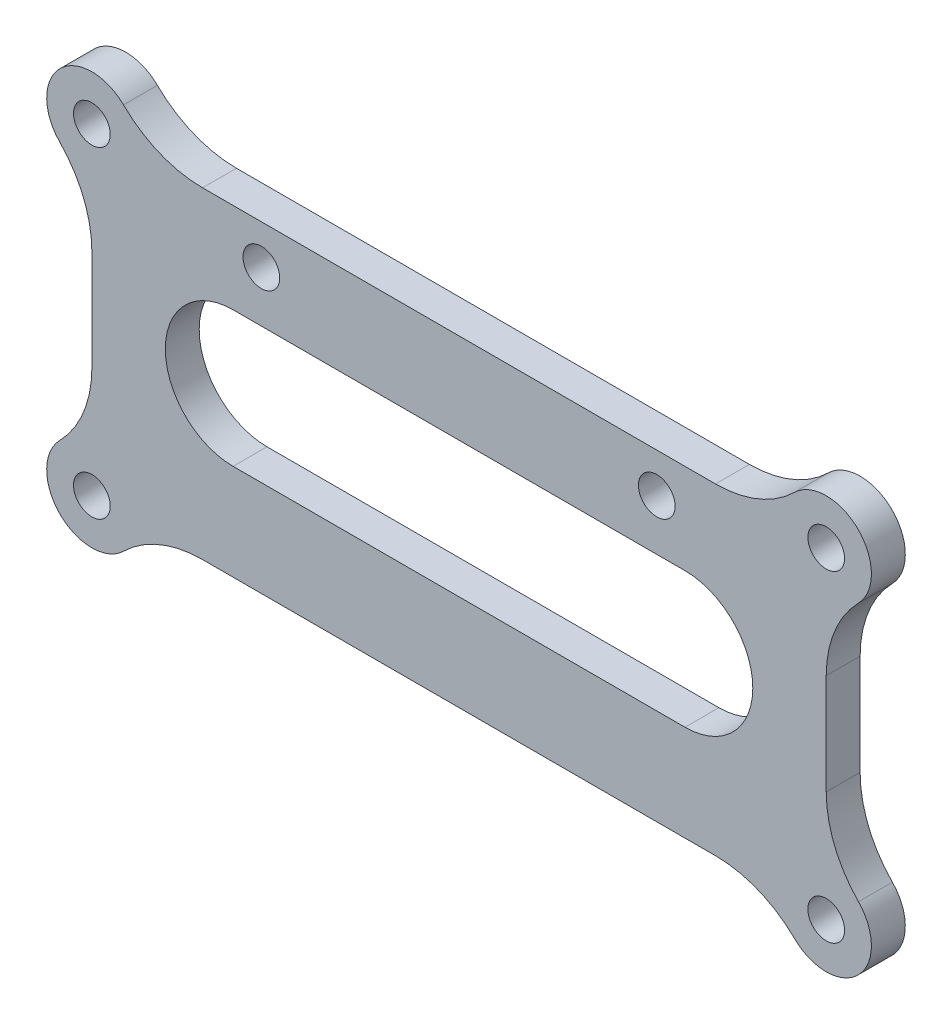
ISO-10303-21;
HEADER;
FILE_DESCRIPTION(('STEP AP214'),'2;1');
FILE_NAME('part.step','',(''),(''),'','','');
FILE_SCHEMA(('AUTOMOTIVE_DESIGN { 1 0 10303 214 1 1 1 1 }'));
ENDSEC;
DATA;
#1=APPLICATION_CONTEXT('core data for automotive mechanical design processes');
#2=APPLICATION_PROTOCOL_DEFINITION('international standard','automotive_design',2000,#1);
#3=PRODUCT_CONTEXT('',#1,'mechanical');
#4=PRODUCT('Part','Part','',(#3));
#5=PRODUCT_RELATED_PRODUCT_CATEGORY('part','',(#4));
#6=PRODUCT_DEFINITION_FORMATION('','',#4);
#7=PRODUCT_DEFINITION_CONTEXT('part definition',#1,'design');
#8=PRODUCT_DEFINITION('design','',#6,#7);
#9=PRODUCT_DEFINITION_SHAPE('','',#8);
#10=(LENGTH_UNIT() NAMED_UNIT(*) SI_UNIT(.MILLI.,.METRE.));
#11=(NAMED_UNIT(*) PLANE_ANGLE_UNIT() SI_UNIT($,.RADIAN.));
#12=(NAMED_UNIT(*) SI_UNIT($,.STERADIAN.) SOLID_ANGLE_UNIT());
#13=UNCERTAINTY_MEASURE_WITH_UNIT(LENGTH_MEASURE(1.E-05),#10,'distance_accuracy_value','');
#14=(GEOMETRIC_REPRESENTATION_CONTEXT(3) GLOBAL_UNCERTAINTY_ASSIGNED_CONTEXT((#13)) GLOBAL_UNIT_ASSIGNED_CONTEXT((#10,
#11,#12)) REPRESENTATION_CONTEXT('',''));
#15=CARTESIAN_POINT('',(0.,0.,0.));
#16=DIRECTION('',(0.,0.,1.));
#17=DIRECTION('',(1.,0.,0.));
#18=AXIS2_PLACEMENT_3D('',#15,#16,#17);
#19=CARTESIAN_POINT('',(32.4999999999997,0.,3.));
#20=DIRECTION('',(0.,0.,-1.));
#21=DIRECTION('',(-1.,0.,0.));
#22=AXIS2_PLACEMENT_3D('',#19,#20,#21);
#23=CYLINDRICAL_SURFACE('',#22,4.);
#24=CARTESIAN_POINT('',(32.4999999999997,0.,0.));
#25=DIRECTION('',(0.,0.,1.));
#26=DIRECTION('',(1.,0.,0.));
#27=AXIS2_PLACEMENT_3D('',#24,#25,#26);
#28=CIRCLE('',#27,4.);
#29=CARTESIAN_POINT('',(29.7005831511047,-2.85714285714286,0.));
#30=VERTEX_POINT('',#29);
#31=CARTESIAN_POINT('',(35.3571428571426,2.79941684889507,0.));
#32=VERTEX_POINT('',#31);
#33=EDGE_CURVE('E219',#30,#32,#28,.T.);
#34=ORIENTED_EDGE('',*,*,#33,.T.);
#35=DIRECTION('',(0.,0.,-1.));
#36=VECTOR('',#35,1.);
#37=CARTESIAN_POINT('',(35.3571428571426,2.79941684889507,3.));
#38=LINE('',#37,#36);
#39=CARTESIAN_POINT('',(35.3571428571426,2.79941684889507,3.));
#40=VERTEX_POINT('',#39);
#41=EDGE_CURVE('E309',#32,#40,#38,.F.);
#42=ORIENTED_EDGE('',*,*,#41,.T.);
#43=CARTESIAN_POINT('',(32.4999999999997,0.,3.));
#44=DIRECTION('',(0.,0.,1.));
#45=DIRECTION('',(1.,0.,0.));
#46=AXIS2_PLACEMENT_3D('',#43,#44,#45);
#47=CIRCLE('',#46,4.);
#48=CARTESIAN_POINT('',(29.7005831511047,-2.85714285714286,3.));
#49=VERTEX_POINT('',#48);
#50=EDGE_CURVE('E220',#49,#40,#47,.T.);
#51=ORIENTED_EDGE('',*,*,#50,.F.);
#52=DIRECTION('',(0.,0.,-1.));
#53=VECTOR('',#52,1.);
#54=CARTESIAN_POINT('',(29.7005831511047,-2.85714285714286,3.));
#55=LINE('',#54,#53);
#56=EDGE_CURVE('E306',#49,#30,#55,.T.);
#57=ORIENTED_EDGE('',*,*,#56,.T.);
#58=EDGE_LOOP('',(#34,#42,#51,#57));
#59=FACE_BOUND('',#58,.T.);
#60=ADVANCED_FACE('F36',(#59),#23,.T.);
#61=CARTESIAN_POINT('',(32.4999999999997,1.18691606251044E-13,3.));
#62=DIRECTION('',(-1.,0.,0.));
#63=DIRECTION('',(0.,-1.,0.));
#64=AXIS2_PLACEMENT_3D('',#61,#62,#63);
#65=PLANE('',#64);
#66=DIRECTION('',(0.,1.,0.));
#67=VECTOR('',#66,1.);
#68=CARTESIAN_POINT('',(32.4999999999997,1.18691606251044E-13,3.));
#69=LINE('',#68,#67);
#70=CARTESIAN_POINT('',(32.4999999999997,9.79795897113271,3.));
#71=VERTEX_POINT('',#70);
#72=CARTESIAN_POINT('',(32.4999999999996,18.7020410288673,3.));
#73=VERTEX_POINT('',#72);
#74=EDGE_CURVE('E223',#71,#73,#69,.T.);
#75=ORIENTED_EDGE('',*,*,#74,.F.);
#76=DIRECTION('',(0.,0.,1.));
#77=VECTOR('',#76,1.);
#78=CARTESIAN_POINT('',(32.4999999999997,9.79795897113271,0.));
#79=LINE('',#78,#77);
#80=CARTESIAN_POINT('',(32.4999999999997,9.79795897113271,0.));
#81=VERTEX_POINT('',#80);
#82=EDGE_CURVE('E303',#71,#81,#79,.F.);
#83=ORIENTED_EDGE('',*,*,#82,.T.);
#84=DIRECTION('',(0.,1.,0.));
#85=VECTOR('',#84,1.);
#86=CARTESIAN_POINT('',(32.4999999999997,1.18691606251044E-13,0.));
#87=LINE('',#86,#85);
#88=CARTESIAN_POINT('',(32.4999999999996,18.7020410288673,0.));
#89=VERTEX_POINT('',#88);
#90=EDGE_CURVE('E260',#81,#89,#87,.T.);
#91=ORIENTED_EDGE('',*,*,#90,.T.);
#92=DIRECTION('',(0.,0.,1.));
#93=VECTOR('',#92,1.);
#94=CARTESIAN_POINT('',(32.4999999999996,18.7020410288673,3.));
#95=LINE('',#94,#93);
#96=EDGE_CURVE('E301',#89,#73,#95,.T.);
#97=ORIENTED_EDGE('',*,*,#96,.T.);
#98=EDGE_LOOP('',(#75,#83,#91,#97));
#99=FACE_BOUND('',#98,.T.);
#100=ADVANCED_FACE('F368',(#99),#65,.F.);
#101=CARTESIAN_POINT('',(32.4999999999996,28.5,3.));
#102=DIRECTION('',(0.,0.,-1.));
#103=DIRECTION('',(-1.,0.,0.));
#104=AXIS2_PLACEMENT_3D('',#101,#102,#103);
#105=CYLINDRICAL_SURFACE('',#104,4.);
#106=CARTESIAN_POINT('',(32.4999999999996,28.5,0.));
#107=DIRECTION('',(0.,0.,1.));
#108=DIRECTION('',(1.,0.,0.));
#109=AXIS2_PLACEMENT_3D('',#106,#107,#108);
#110=CIRCLE('',#109,4.);
#111=CARTESIAN_POINT('',(35.3571428571425,25.700583151105,0.));
#112=VERTEX_POINT('',#111);
#113=CARTESIAN_POINT('',(29.7005831511046,31.3571428571429,0.));
#114=VERTEX_POINT('',#113);
#115=EDGE_CURVE('E263',#112,#114,#110,.T.);
#116=ORIENTED_EDGE('',*,*,#115,.T.);
#117=DIRECTION('',(0.,0.,-1.));
#118=VECTOR('',#117,1.);
#119=CARTESIAN_POINT('',(29.7005831511046,31.3571428571429,3.));
#120=LINE('',#119,#118);
#121=CARTESIAN_POINT('',(29.7005831511046,31.3571428571429,3.));
#122=VERTEX_POINT('',#121);
#123=EDGE_CURVE('E329',#114,#122,#120,.F.);
#124=ORIENTED_EDGE('',*,*,#123,.T.);
#125=CARTESIAN_POINT('',(32.4999999999996,28.5,3.));
#126=DIRECTION('',(0.,0.,1.));
#127=DIRECTION('',(1.,0.,0.));
#128=AXIS2_PLACEMENT_3D('',#125,#126,#127);
#129=CIRCLE('',#128,4.);
#130=CARTESIAN_POINT('',(35.3571428571425,25.700583151105,3.));
#131=VERTEX_POINT('',#130);
#132=EDGE_CURVE('E227',#131,#122,#129,.T.);
#133=ORIENTED_EDGE('',*,*,#132,.F.);
#134=DIRECTION('',(0.,0.,-1.));
#135=VECTOR('',#134,1.);
#136=CARTESIAN_POINT('',(35.3571428571425,25.700583151105,3.));
#137=LINE('',#136,#135);
#138=EDGE_CURVE('E326',#131,#112,#137,.T.);
#139=ORIENTED_EDGE('',*,*,#138,.T.);
#140=EDGE_LOOP('',(#116,#124,#133,#139));
#141=FACE_BOUND('',#140,.T.);
#142=ADVANCED_FACE('F377',(#141),#105,.T.);
#143=CARTESIAN_POINT('',(0.,28.5,3.));
#144=DIRECTION('',(0.,1.,0.));
#145=DIRECTION('',(0.,0.,1.));
#146=AXIS2_PLACEMENT_3D('',#143,#144,#145);
#147=PLANE('',#146);
#148=DIRECTION('',(1.,0.,0.));
#149=VECTOR('',#148,1.);
#150=CARTESIAN_POINT('',(0.,28.5,0.));
#151=LINE('',#150,#149);
#152=CARTESIAN_POINT('',(-22.7020410288674,28.5,0.));
#153=VERTEX_POINT('',#152);
#154=CARTESIAN_POINT('',(22.7020410288669,28.5,0.));
#155=VERTEX_POINT('',#154);
#156=EDGE_CURVE('E266',#153,#155,#151,.T.);
#157=ORIENTED_EDGE('',*,*,#156,.F.);
#158=DIRECTION('',(0.,0.,-1.));
#159=VECTOR('',#158,1.);
#160=CARTESIAN_POINT('',(-22.7020410288674,28.5,3.));
#161=LINE('',#160,#159);
#162=CARTESIAN_POINT('',(-22.7020410288674,28.5,3.));
#163=VERTEX_POINT('',#162);
#164=EDGE_CURVE('E324',#153,#163,#161,.F.);
#165=ORIENTED_EDGE('',*,*,#164,.T.);
#166=DIRECTION('',(1.,0.,0.));
#167=VECTOR('',#166,1.);
#168=CARTESIAN_POINT('',(0.,28.5,3.));
#169=LINE('',#168,#167);
#170=CARTESIAN_POINT('',(22.7020410288669,28.5,3.));
#171=VERTEX_POINT('',#170);
#172=EDGE_CURVE('E230',#163,#171,#169,.T.);
#173=ORIENTED_EDGE('',*,*,#172,.T.);
#174=DIRECTION('',(0.,0.,-1.));
#175=VECTOR('',#174,1.);
#176=CARTESIAN_POINT('',(22.7020410288669,28.5,3.));
#177=LINE('',#176,#175);
#178=EDGE_CURVE('E321',#171,#155,#177,.T.);
#179=ORIENTED_EDGE('',*,*,#178,.T.);
#180=EDGE_LOOP('',(#157,#165,#173,#179));
#181=FACE_BOUND('',#180,.T.);
#182=ADVANCED_FACE('F386',(#181),#147,.T.);
#183=CARTESIAN_POINT('',(-32.5000000000001,28.5,3.));
#184=DIRECTION('',(0.,0.,-1.));
#185=DIRECTION('',(-1.,0.,0.));
#186=AXIS2_PLACEMENT_3D('',#183,#184,#185);
#187=CYLINDRICAL_SURFACE('',#186,4.);
#188=CARTESIAN_POINT('',(-32.5000000000001,28.5,0.));
#189=DIRECTION('',(0.,0.,1.));
#190=DIRECTION('',(1.,0.,0.));
#191=AXIS2_PLACEMENT_3D('',#188,#189,#190);
#192=CIRCLE('',#191,4.);
#193=CARTESIAN_POINT('',(-29.700583151105,31.3571428571429,0.));
#194=VERTEX_POINT('',#193);
#195=CARTESIAN_POINT('',(-35.3571428571429,25.7005831511049,0.));
#196=VERTEX_POINT('',#195);
#197=EDGE_CURVE('E269',#194,#196,#192,.T.);
#198=ORIENTED_EDGE('',*,*,#197,.T.);
#199=DIRECTION('',(0.,0.,-1.));
#200=VECTOR('',#199,1.);
#201=CARTESIAN_POINT('',(-35.3571428571429,25.7005831511049,3.));
#202=LINE('',#201,#200);
#203=CARTESIAN_POINT('',(-35.3571428571429,25.7005831511049,3.));
#204=VERTEX_POINT('',#203);
#205=EDGE_CURVE('E299',#196,#204,#202,.F.);
#206=ORIENTED_EDGE('',*,*,#205,.T.);
#207=CARTESIAN_POINT('',(-32.5000000000001,28.5,3.));
#208=DIRECTION('',(0.,0.,1.));
#209=DIRECTION('',(1.,0.,0.));
#210=AXIS2_PLACEMENT_3D('',#207,#208,#209);
#211=CIRCLE('',#210,4.);
#212=CARTESIAN_POINT('',(-29.700583151105,31.3571428571429,3.));
#213=VERTEX_POINT('',#212);
#214=EDGE_CURVE('E233',#213,#204,#211,.T.);
#215=ORIENTED_EDGE('',*,*,#214,.F.);
#216=DIRECTION('',(0.,0.,-1.));
#217=VECTOR('',#216,1.);
#218=CARTESIAN_POINT('',(-29.700583151105,31.3571428571429,3.));
#219=LINE('',#218,#217);
#220=EDGE_CURVE('E296',#213,#194,#219,.T.);
#221=ORIENTED_EDGE('',*,*,#220,.T.);
#222=EDGE_LOOP('',(#198,#206,#215,#221));
#223=FACE_BOUND('',#222,.T.);
#224=ADVANCED_FACE('F394',(#223),#187,.T.);
#225=CARTESIAN_POINT('',(-32.4999999999999,-2.53208760002228E-13,3.));
#226=DIRECTION('',(-1.,0.,0.));
#227=DIRECTION('',(0.,-1.,0.));
#228=AXIS2_PLACEMENT_3D('',#225,#226,#227);
#229=PLANE('',#228);
#230=DIRECTION('',(0.,1.,0.));
#231=VECTOR('',#230,1.);
#232=CARTESIAN_POINT('',(-32.4999999999999,-2.53208760002228E-13,3.));
#233=LINE('',#232,#231);
#234=CARTESIAN_POINT('',(-32.5,9.79795897113271,3.));
#235=VERTEX_POINT('',#234);
#236=CARTESIAN_POINT('',(-32.5,18.7020410288673,3.));
#237=VERTEX_POINT('',#236);
#238=EDGE_CURVE('E236',#235,#237,#233,.T.);
#239=ORIENTED_EDGE('',*,*,#238,.T.);
#240=DIRECTION('',(0.,0.,-1.));
#241=VECTOR('',#240,1.);
#242=CARTESIAN_POINT('',(-32.5,18.7020410288673,3.));
#243=LINE('',#242,#241);
#244=CARTESIAN_POINT('',(-32.5,18.7020410288673,0.));
#245=VERTEX_POINT('',#244);
#246=EDGE_CURVE('E293',#237,#245,#243,.T.);
#247=ORIENTED_EDGE('',*,*,#246,.T.);
#248=DIRECTION('',(0.,1.,0.));
#249=VECTOR('',#248,1.);
#250=CARTESIAN_POINT('',(-32.4999999999999,-2.53208760002228E-13,0.));
#251=LINE('',#250,#249);
#252=CARTESIAN_POINT('',(-32.5,9.79795897113271,0.));
#253=VERTEX_POINT('',#252);
#254=EDGE_CURVE('E272',#253,#245,#251,.T.);
#255=ORIENTED_EDGE('',*,*,#254,.F.);
#256=DIRECTION('',(0.,0.,-1.));
#257=VECTOR('',#256,1.);
#258=CARTESIAN_POINT('',(-32.5,9.79795897113271,3.));
#259=LINE('',#258,#257);
#260=EDGE_CURVE('E257',#253,#235,#259,.F.);
#261=ORIENTED_EDGE('',*,*,#260,.T.);
#262=EDGE_LOOP('',(#239,#247,#255,#261));
#263=FACE_BOUND('',#262,.T.);
#264=ADVANCED_FACE('F403',(#263),#229,.T.);
#265=CARTESIAN_POINT('',(-32.4999999999999,0.,3.));
#266=DIRECTION('',(0.,0.,-1.));
#267=DIRECTION('',(-1.,0.,0.));
#268=AXIS2_PLACEMENT_3D('',#265,#266,#267);
#269=CYLINDRICAL_SURFACE('',#268,4.);
#270=CARTESIAN_POINT('',(-32.4999999999999,0.,0.));
#271=DIRECTION('',(0.,0.,1.));
#272=DIRECTION('',(1.,0.,0.));
#273=AXIS2_PLACEMENT_3D('',#270,#271,#272);
#274=CIRCLE('',#273,4.);
#275=CARTESIAN_POINT('',(-35.3571428571428,2.79941684889504,0.));
#276=VERTEX_POINT('',#275);
#277=CARTESIAN_POINT('',(-29.7005831511048,-2.85714285714286,0.));
#278=VERTEX_POINT('',#277);
#279=EDGE_CURVE('E275',#276,#278,#274,.T.);
#280=ORIENTED_EDGE('',*,*,#279,.T.);
#281=DIRECTION('',(0.,0.,-1.));
#282=VECTOR('',#281,1.);
#283=CARTESIAN_POINT('',(-29.7005831511048,-2.85714285714286,3.));
#284=LINE('',#283,#282);
#285=CARTESIAN_POINT('',(-29.7005831511048,-2.85714285714286,3.));
#286=VERTEX_POINT('',#285);
#287=EDGE_CURVE('E319',#278,#286,#284,.F.);
#288=ORIENTED_EDGE('',*,*,#287,.T.);
#289=CARTESIAN_POINT('',(-32.4999999999999,0.,3.));
#290=DIRECTION('',(0.,0.,1.));
#291=DIRECTION('',(1.,0.,0.));
#292=AXIS2_PLACEMENT_3D('',#289,#290,#291);
#293=CIRCLE('',#292,4.);
#294=CARTESIAN_POINT('',(-35.3571428571428,2.79941684889504,3.));
#295=VERTEX_POINT('',#294);
#296=EDGE_CURVE('E239',#295,#286,#293,.T.);
#297=ORIENTED_EDGE('',*,*,#296,.F.);
#298=DIRECTION('',(0.,0.,-1.));
#299=VECTOR('',#298,1.);
#300=CARTESIAN_POINT('',(-35.3571428571428,2.79941684889504,3.));
#301=LINE('',#300,#299);
#302=EDGE_CURVE('E316',#295,#276,#301,.T.);
#303=ORIENTED_EDGE('',*,*,#302,.T.);
#304=EDGE_LOOP('',(#280,#288,#297,#303));
#305=FACE_BOUND('',#304,.T.);
#306=ADVANCED_FACE('F412',(#305),#269,.T.);
#307=CARTESIAN_POINT('',(-32.5000000000001,28.5,3.));
#308=DIRECTION('',(0.,0.,-1.));
#309=DIRECTION('',(-1.,0.,0.));
#310=AXIS2_PLACEMENT_3D('',#307,#308,#309);
#311=CYLINDRICAL_SURFACE('',#310,1.62500000000004);
#312=CARTESIAN_POINT('',(-32.5000000000001,28.5,3.));
#313=DIRECTION('',(0.,0.,1.));
#314=DIRECTION('',(1.,0.,0.));
#315=AXIS2_PLACEMENT_3D('',#312,#313,#314);
#316=CIRCLE('',#315,1.62500000000004);
#317=CARTESIAN_POINT('',(-30.8750000000001,28.5,3.));
#318=VERTEX_POINT('',#317);
#319=EDGE_CURVE('E251',#318,#318,#316,.T.);
#320=ORIENTED_EDGE('',*,*,#319,.T.);
#321=EDGE_LOOP('',(#320));
#322=FACE_BOUND('',#321,.T.);
#323=CARTESIAN_POINT('',(-32.5000000000001,28.5,0.));
#324=DIRECTION('',(0.,0.,1.));
#325=DIRECTION('',(1.,0.,0.));
#326=AXIS2_PLACEMENT_3D('',#323,#324,#325);
#327=CIRCLE('',#326,1.62500000000004);
#328=CARTESIAN_POINT('',(-30.8750000000001,28.5,0.));
#329=VERTEX_POINT('',#328);
#330=EDGE_CURVE('E287',#329,#329,#327,.T.);
#331=ORIENTED_EDGE('',*,*,#330,.F.);
#332=EDGE_LOOP('',(#331));
#333=FACE_BOUND('',#332,.T.);
#334=ADVANCED_FACE('F458',(#322,#333),#311,.F.);
#335=CARTESIAN_POINT('',(32.4999999999997,0.,3.));
#336=DIRECTION('',(0.,0.,-1.));
#337=DIRECTION('',(-1.,0.,0.));
#338=AXIS2_PLACEMENT_3D('',#335,#336,#337);
#339=CYLINDRICAL_SURFACE('',#338,1.625);
#340=CARTESIAN_POINT('',(32.4999999999997,0.,3.));
#341=DIRECTION('',(0.,0.,1.));
#342=DIRECTION('',(1.,0.,0.));
#343=AXIS2_PLACEMENT_3D('',#340,#341,#342);
#344=CIRCLE('',#343,1.625);
#345=CARTESIAN_POINT('',(34.1249999999997,0.,3.));
#346=VERTEX_POINT('',#345);
#347=EDGE_CURVE('E248',#346,#346,#344,.T.);
#348=ORIENTED_EDGE('',*,*,#347,.T.);
#349=EDGE_LOOP('',(#348));
#350=FACE_BOUND('',#349,.T.);
#351=CARTESIAN_POINT('',(32.4999999999997,0.,0.));
#352=DIRECTION('',(0.,0.,1.));
#353=DIRECTION('',(1.,0.,0.));
#354=AXIS2_PLACEMENT_3D('',#351,#352,#353);
#355=CIRCLE('',#354,1.625);
#356=CARTESIAN_POINT('',(34.1249999999997,0.,0.));
#357=VERTEX_POINT('',#356);
#358=EDGE_CURVE('E284',#357,#357,#355,.T.);
#359=ORIENTED_EDGE('',*,*,#358,.F.);
#360=EDGE_LOOP('',(#359));
#361=FACE_BOUND('',#360,.T.);
#362=ADVANCED_FACE('F465',(#350,#361),#339,.F.);
#363=CARTESIAN_POINT('',(32.4999999999996,28.5,3.));
#364=DIRECTION('',(0.,0.,-1.));
#365=DIRECTION('',(-1.,0.,0.));
#366=AXIS2_PLACEMENT_3D('',#363,#364,#365);
#367=CYLINDRICAL_SURFACE('',#366,1.625);
#368=CARTESIAN_POINT('',(32.4999999999996,28.5,3.));
#369=DIRECTION('',(0.,0.,1.));
#370=DIRECTION('',(1.,0.,0.));
#371=AXIS2_PLACEMENT_3D('',#368,#369,#370);
#372=CIRCLE('',#371,1.625);
#373=CARTESIAN_POINT('',(34.1249999999996,28.5,3.));
#374=VERTEX_POINT('',#373);
#375=EDGE_CURVE('E245',#374,#374,#372,.T.);
#376=ORIENTED_EDGE('',*,*,#375,.T.);
#377=EDGE_LOOP('',(#376));
#378=FACE_BOUND('',#377,.T.);
#379=CARTESIAN_POINT('',(32.4999999999996,28.5,0.));
#380=DIRECTION('',(0.,0.,1.));
#381=DIRECTION('',(1.,0.,0.));
#382=AXIS2_PLACEMENT_3D('',#379,#380,#381);
#383=CIRCLE('',#382,1.625);
#384=CARTESIAN_POINT('',(34.1249999999996,28.5,0.));
#385=VERTEX_POINT('',#384);
#386=EDGE_CURVE('E281',#385,#385,#383,.T.);
#387=ORIENTED_EDGE('',*,*,#386,.F.);
#388=EDGE_LOOP('',(#387));
#389=FACE_BOUND('',#388,.T.);
#390=ADVANCED_FACE('F462',(#378,#389),#367,.F.);
#391=CARTESIAN_POINT('',(0.,0.,3.));
#392=DIRECTION('',(0.,1.,0.));
#393=DIRECTION('',(0.,0.,1.));
#394=AXIS2_PLACEMENT_3D('',#391,#392,#393);
#395=PLANE('',#394);
#396=DIRECTION('',(1.,0.,0.));
#397=VECTOR('',#396,1.);
#398=CARTESIAN_POINT('',(0.,0.,0.));
#399=LINE('',#398,#397);
#400=CARTESIAN_POINT('',(-22.7020410288672,0.,0.));
#401=VERTEX_POINT('',#400);
#402=CARTESIAN_POINT('',(22.702041028867,0.,0.));
#403=VERTEX_POINT('',#402);
#404=EDGE_CURVE('E278',#401,#403,#399,.T.);
#405=ORIENTED_EDGE('',*,*,#404,.T.);
#406=DIRECTION('',(0.,0.,1.));
#407=VECTOR('',#406,1.);
#408=CARTESIAN_POINT('',(22.702041028867,0.,3.));
#409=LINE('',#408,#407);
#410=CARTESIAN_POINT('',(22.702041028867,0.,3.));
#411=VERTEX_POINT('',#410);
#412=EDGE_CURVE('E314',#403,#411,#409,.T.);
#413=ORIENTED_EDGE('',*,*,#412,.T.);
#414=DIRECTION('',(1.,0.,0.));
#415=VECTOR('',#414,1.);
#416=CARTESIAN_POINT('',(0.,0.,3.));
#417=LINE('',#416,#415);
#418=CARTESIAN_POINT('',(-22.7020410288672,0.,3.));
#419=VERTEX_POINT('',#418);
#420=EDGE_CURVE('E242',#419,#411,#417,.T.);
#421=ORIENTED_EDGE('',*,*,#420,.F.);
#422=DIRECTION('',(0.,0.,1.));
#423=VECTOR('',#422,1.);
#424=CARTESIAN_POINT('',(-22.7020410288672,0.,0.));
#425=LINE('',#424,#423);
#426=EDGE_CURVE('E311',#419,#401,#425,.F.);
#427=ORIENTED_EDGE('',*,*,#426,.T.);
#428=EDGE_LOOP('',(#405,#413,#421,#427));
#429=FACE_BOUND('',#428,.T.);
#430=ADVANCED_FACE('F421',(#429),#395,.F.);
#431=CARTESIAN_POINT('',(-32.4999999999999,0.,3.));
#432=DIRECTION('',(0.,0.,-1.));
#433=DIRECTION('',(-1.,0.,0.));
#434=AXIS2_PLACEMENT_3D('',#431,#432,#433);
#435=CYLINDRICAL_SURFACE('',#434,1.625);
#436=CARTESIAN_POINT('',(-32.4999999999999,0.,3.));
#437=DIRECTION('',(0.,0.,1.));
#438=DIRECTION('',(1.,0.,0.));
#439=AXIS2_PLACEMENT_3D('',#436,#437,#438);
#440=CIRCLE('',#439,1.625);
#441=CARTESIAN_POINT('',(-30.8749999999999,0.,3.));
#442=VERTEX_POINT('',#441);
#443=EDGE_CURVE('E254',#442,#442,#440,.T.);
#444=ORIENTED_EDGE('',*,*,#443,.T.);
#445=EDGE_LOOP('',(#444));
#446=FACE_BOUND('',#445,.T.);
#447=CARTESIAN_POINT('',(-32.4999999999999,0.,0.));
#448=DIRECTION('',(0.,0.,1.));
#449=DIRECTION('',(1.,0.,0.));
#450=AXIS2_PLACEMENT_3D('',#447,#448,#449);
#451=CIRCLE('',#450,1.625);
#452=CARTESIAN_POINT('',(-30.8749999999999,0.,0.));
#453=VERTEX_POINT('',#452);
#454=EDGE_CURVE('E224',#453,#453,#451,.T.);
#455=ORIENTED_EDGE('',*,*,#454,.F.);
#456=EDGE_LOOP('',(#455));
#457=FACE_BOUND('',#456,.T.);
#458=ADVANCED_FACE('F461',(#446,#457),#435,.F.);
#459=CARTESIAN_POINT('',(0.,0.,3.));
#460=DIRECTION('',(0.,0.,1.));
#461=DIRECTION('',(1.,0.,0.));
#462=AXIS2_PLACEMENT_3D('',#459,#460,#461);
#463=PLANE('',#462);
#464=CARTESIAN_POINT('',(20.,14.5,3.));
#465=DIRECTION('',(0.,0.,1.));
#466=DIRECTION('',(1.,0.,0.));
#467=AXIS2_PLACEMENT_3D('',#464,#465,#466);
#468=CIRCLE('',#467,6.);
#469=CARTESIAN_POINT('',(20.,8.50000000000001,3.));
#470=VERTEX_POINT('',#469);
#471=CARTESIAN_POINT('',(20.,20.5,3.));
#472=VERTEX_POINT('',#471);
#473=EDGE_CURVE('E205',#470,#472,#468,.T.);
#474=ORIENTED_EDGE('',*,*,#473,.F.);
#475=DIRECTION('',(1.,0.,0.));
#476=VECTOR('',#475,1.);
#477=CARTESIAN_POINT('',(0.,8.50000000000001,3.));
#478=LINE('',#477,#476);
#479=CARTESIAN_POINT('',(-20.,8.50000000000001,3.));
#480=VERTEX_POINT('',#479);
#481=EDGE_CURVE('E198',#480,#470,#478,.T.);
#482=ORIENTED_EDGE('',*,*,#481,.F.);
#483=CARTESIAN_POINT('',(-20.,14.5,3.));
#484=DIRECTION('',(0.,0.,1.));
#485=DIRECTION('',(1.,0.,0.));
#486=AXIS2_PLACEMENT_3D('',#483,#484,#485);
#487=CIRCLE('',#486,6.);
#488=CARTESIAN_POINT('',(-20.,20.5,3.));
#489=VERTEX_POINT('',#488);
#490=EDGE_CURVE('E178',#489,#480,#487,.T.);
#491=ORIENTED_EDGE('',*,*,#490,.F.);
#492=DIRECTION('',(-1.,0.,0.));
#493=VECTOR('',#492,1.);
#494=CARTESIAN_POINT('',(0.,20.5,3.));
#495=LINE('',#494,#493);
#496=EDGE_CURVE('E203',#472,#489,#495,.T.);
#497=ORIENTED_EDGE('',*,*,#496,.F.);
#498=EDGE_LOOP('',(#474,#482,#491,#497));
#499=FACE_BOUND('',#498,.T.);
#500=CARTESIAN_POINT('',(17.5,25.,3.));
#501=DIRECTION('',(0.,0.,1.));
#502=DIRECTION('',(1.,0.,0.));
#503=AXIS2_PLACEMENT_3D('',#500,#501,#502);
#504=CIRCLE('',#503,1.625);
#505=CARTESIAN_POINT('',(19.125,25.,3.));
#506=VERTEX_POINT('',#505);
#507=EDGE_CURVE('E216',#506,#506,#504,.T.);
#508=ORIENTED_EDGE('',*,*,#507,.F.);
#509=EDGE_LOOP('',(#508));
#510=FACE_BOUND('',#509,.T.);
#511=CARTESIAN_POINT('',(-17.5,25.,3.));
#512=DIRECTION('',(0.,0.,1.));
#513=DIRECTION('',(1.,0.,0.));
#514=AXIS2_PLACEMENT_3D('',#511,#512,#513);
#515=CIRCLE('',#514,1.625);
#516=CARTESIAN_POINT('',(-15.875,25.,3.));
#517=VERTEX_POINT('',#516);
#518=EDGE_CURVE('E211',#517,#517,#515,.T.);
#519=ORIENTED_EDGE('',*,*,#518,.F.);
#520=EDGE_LOOP('',(#519));
#521=FACE_BOUND('',#520,.T.);
#522=ORIENTED_EDGE('',*,*,#420,.T.);
#523=CARTESIAN_POINT('',(22.702041028867,-10.,3.));
#524=DIRECTION('',(0.,0.,1.));
#525=DIRECTION('',(1.,0.,0.));
#526=AXIS2_PLACEMENT_3D('',#523,#524,#525);
#527=CIRCLE('',#526,10.);
#528=EDGE_CURVE('E341',#411,#49,#527,.F.);
#529=ORIENTED_EDGE('',*,*,#528,.T.);
#530=ORIENTED_EDGE('',*,*,#50,.T.);
#531=CARTESIAN_POINT('',(42.4999999999997,9.79795897113274,3.));
#532=DIRECTION('',(0.,0.,1.));
#533=DIRECTION('',(1.,0.,0.));
#534=AXIS2_PLACEMENT_3D('',#531,#532,#533);
#535=CIRCLE('',#534,10.);
#536=EDGE_CURVE('E337',#40,#71,#535,.F.);
#537=ORIENTED_EDGE('',*,*,#536,.T.);
#538=ORIENTED_EDGE('',*,*,#74,.T.);
#539=CARTESIAN_POINT('',(42.4999999999997,18.7020410288673,3.));
#540=DIRECTION('',(0.,0.,1.));
#541=DIRECTION('',(1.,0.,0.));
#542=AXIS2_PLACEMENT_3D('',#539,#540,#541);
#543=CIRCLE('',#542,10.);
#544=EDGE_CURVE('E11',#73,#131,#543,.F.);
#545=ORIENTED_EDGE('',*,*,#544,.T.);
#546=ORIENTED_EDGE('',*,*,#132,.T.);
#547=CARTESIAN_POINT('',(22.7020410288669,38.5,3.));
#548=DIRECTION('',(0.,0.,1.));
#549=DIRECTION('',(1.,0.,0.));
#550=AXIS2_PLACEMENT_3D('',#547,#548,#549);
#551=CIRCLE('',#550,10.);
#552=EDGE_CURVE('E357',#122,#171,#551,.F.);
#553=ORIENTED_EDGE('',*,*,#552,.T.);
#554=ORIENTED_EDGE('',*,*,#172,.F.);
#555=CARTESIAN_POINT('',(-22.7020410288674,38.5,3.));
#556=DIRECTION('',(0.,0.,1.));
#557=DIRECTION('',(1.,0.,0.));
#558=AXIS2_PLACEMENT_3D('',#555,#556,#557);
#559=CIRCLE('',#558,10.);
#560=EDGE_CURVE('E353',#163,#213,#559,.F.);
#561=ORIENTED_EDGE('',*,*,#560,.T.);
#562=ORIENTED_EDGE('',*,*,#214,.T.);
#563=CARTESIAN_POINT('',(-42.5,18.7020410288672,3.));
#564=DIRECTION('',(0.,0.,1.));
#565=DIRECTION('',(1.,0.,0.));
#566=AXIS2_PLACEMENT_3D('',#563,#564,#565);
#567=CIRCLE('',#566,10.);
#568=EDGE_CURVE('E333',#204,#237,#567,.F.);
#569=ORIENTED_EDGE('',*,*,#568,.T.);
#570=ORIENTED_EDGE('',*,*,#238,.F.);
#571=CARTESIAN_POINT('',(-42.5,9.79795897113263,3.));
#572=DIRECTION('',(0.,0.,1.));
#573=DIRECTION('',(1.,0.,0.));
#574=AXIS2_PLACEMENT_3D('',#571,#572,#573);
#575=CIRCLE('',#574,10.);
#576=EDGE_CURVE('E349',#235,#295,#575,.F.);
#577=ORIENTED_EDGE('',*,*,#576,.T.);
#578=ORIENTED_EDGE('',*,*,#296,.T.);
#579=CARTESIAN_POINT('',(-22.7020410288672,-10.,3.));
#580=DIRECTION('',(0.,0.,1.));
#581=DIRECTION('',(1.,0.,0.));
#582=AXIS2_PLACEMENT_3D('',#579,#580,#581);
#583=CIRCLE('',#582,10.);
#584=EDGE_CURVE('E345',#286,#419,#583,.F.);
#585=ORIENTED_EDGE('',*,*,#584,.T.);
#586=EDGE_LOOP('',(#522,#529,#530,#537,#538,#545,#546,#553,#554,#561,#562,#569,#570,#577,#578,#585));
#587=FACE_BOUND('',#586,.T.);
#588=ORIENTED_EDGE('',*,*,#375,.F.);
#589=EDGE_LOOP('',(#588));
#590=FACE_BOUND('',#589,.T.);
#591=ORIENTED_EDGE('',*,*,#347,.F.);
#592=EDGE_LOOP('',(#591));
#593=FACE_BOUND('',#592,.T.);
#594=ORIENTED_EDGE('',*,*,#319,.F.);
#595=EDGE_LOOP('',(#594));
#596=FACE_BOUND('',#595,.T.);
#597=ORIENTED_EDGE('',*,*,#443,.F.);
#598=EDGE_LOOP('',(#597));
#599=FACE_BOUND('',#598,.T.);
#600=ADVANCED_FACE('F373',(#499,#510,#521,#587,#590,#593,#596,#599),#463,.T.);
#601=CARTESIAN_POINT('',(0.,0.,0.));
#602=DIRECTION('',(0.,0.,1.));
#603=DIRECTION('',(1.,0.,0.));
#604=AXIS2_PLACEMENT_3D('',#601,#602,#603);
#605=PLANE('',#604);
#606=DIRECTION('',(-1.,0.,0.));
#607=VECTOR('',#606,1.);
#608=CARTESIAN_POINT('',(20.,8.50000000000001,0.));
#609=LINE('',#608,#607);
#610=CARTESIAN_POINT('',(20.,8.50000000000001,0.));
#611=VERTEX_POINT('',#610);
#612=CARTESIAN_POINT('',(-20.,8.50000000000001,0.));
#613=VERTEX_POINT('',#612);
#614=EDGE_CURVE('E184',#611,#613,#609,.T.);
#615=ORIENTED_EDGE('',*,*,#614,.F.);
#616=CARTESIAN_POINT('',(20.,14.5,0.));
#617=DIRECTION('',(0.,0.,-1.));
#618=DIRECTION('',(-1.,0.,0.));
#619=AXIS2_PLACEMENT_3D('',#616,#617,#618);
#620=CIRCLE('',#619,6.);
#621=CARTESIAN_POINT('',(20.,20.5,0.));
#622=VERTEX_POINT('',#621);
#623=EDGE_CURVE('E59',#622,#611,#620,.T.);
#624=ORIENTED_EDGE('',*,*,#623,.F.);
#625=DIRECTION('',(1.,0.,0.));
#626=VECTOR('',#625,1.);
#627=CARTESIAN_POINT('',(20.,20.5,0.));
#628=LINE('',#627,#626);
#629=CARTESIAN_POINT('',(-20.,20.5,0.));
#630=VERTEX_POINT('',#629);
#631=EDGE_CURVE('E191',#630,#622,#628,.T.);
#632=ORIENTED_EDGE('',*,*,#631,.F.);
#633=CARTESIAN_POINT('',(-20.,14.5,0.));
#634=DIRECTION('',(0.,0.,-1.));
#635=DIRECTION('',(-1.,0.,0.));
#636=AXIS2_PLACEMENT_3D('',#633,#634,#635);
#637=CIRCLE('',#636,6.);
#638=EDGE_CURVE('E175',#613,#630,#637,.T.);
#639=ORIENTED_EDGE('',*,*,#638,.F.);
#640=EDGE_LOOP('',(#615,#624,#632,#639));
#641=FACE_BOUND('',#640,.T.);
#642=CARTESIAN_POINT('',(17.5,25.,0.));
#643=DIRECTION('',(0.,0.,-1.));
#644=DIRECTION('',(-1.,0.,0.));
#645=AXIS2_PLACEMENT_3D('',#642,#643,#644);
#646=CIRCLE('',#645,1.625);
#647=CARTESIAN_POINT('',(15.875,25.,0.));
#648=VERTEX_POINT('',#647);
#649=EDGE_CURVE('E208',#648,#648,#646,.T.);
#650=ORIENTED_EDGE('',*,*,#649,.F.);
#651=EDGE_LOOP('',(#650));
#652=FACE_BOUND('',#651,.T.);
#653=CARTESIAN_POINT('',(-17.5,25.,0.));
#654=DIRECTION('',(0.,0.,-1.));
#655=DIRECTION('',(1.,0.,0.));
#656=AXIS2_PLACEMENT_3D('',#653,#654,#655);
#657=CIRCLE('',#656,1.625);
#658=CARTESIAN_POINT('',(-15.875,25.,0.));
#659=VERTEX_POINT('',#658);
#660=EDGE_CURVE('E207',#659,#659,#657,.T.);
#661=ORIENTED_EDGE('',*,*,#660,.F.);
#662=EDGE_LOOP('',(#661));
#663=FACE_BOUND('',#662,.T.);
#664=ORIENTED_EDGE('',*,*,#33,.F.);
#665=CARTESIAN_POINT('',(22.702041028867,-10.,0.));
#666=DIRECTION('',(0.,0.,1.));
#667=DIRECTION('',(1.,0.,0.));
#668=AXIS2_PLACEMENT_3D('',#665,#666,#667);
#669=CIRCLE('',#668,10.);
#670=EDGE_CURVE('E339',#30,#403,#669,.T.);
#671=ORIENTED_EDGE('',*,*,#670,.T.);
#672=ORIENTED_EDGE('',*,*,#404,.F.);
#673=CARTESIAN_POINT('',(-22.7020410288672,-10.,0.));
#674=DIRECTION('',(0.,0.,1.));
#675=DIRECTION('',(1.,0.,0.));
#676=AXIS2_PLACEMENT_3D('',#673,#674,#675);
#677=CIRCLE('',#676,10.);
#678=EDGE_CURVE('E343',#401,#278,#677,.T.);
#679=ORIENTED_EDGE('',*,*,#678,.T.);
#680=ORIENTED_EDGE('',*,*,#279,.F.);
#681=CARTESIAN_POINT('',(-42.5,9.79795897113263,0.));
#682=DIRECTION('',(0.,0.,1.));
#683=DIRECTION('',(1.,0.,0.));
#684=AXIS2_PLACEMENT_3D('',#681,#682,#683);
#685=CIRCLE('',#684,10.);
#686=EDGE_CURVE('E347',#276,#253,#685,.T.);
#687=ORIENTED_EDGE('',*,*,#686,.T.);
#688=ORIENTED_EDGE('',*,*,#254,.T.);
#689=CARTESIAN_POINT('',(-42.5,18.7020410288672,0.));
#690=DIRECTION('',(0.,0.,1.));
#691=DIRECTION('',(1.,0.,0.));
#692=AXIS2_PLACEMENT_3D('',#689,#690,#691);
#693=CIRCLE('',#692,10.);
#694=EDGE_CURVE('E331',#245,#196,#693,.T.);
#695=ORIENTED_EDGE('',*,*,#694,.T.);
#696=ORIENTED_EDGE('',*,*,#197,.F.);
#697=CARTESIAN_POINT('',(-22.7020410288674,38.5,0.));
#698=DIRECTION('',(0.,0.,1.));
#699=DIRECTION('',(1.,0.,0.));
#700=AXIS2_PLACEMENT_3D('',#697,#698,#699);
#701=CIRCLE('',#700,10.);
#702=EDGE_CURVE('E351',#194,#153,#701,.T.);
#703=ORIENTED_EDGE('',*,*,#702,.T.);
#704=ORIENTED_EDGE('',*,*,#156,.T.);
#705=CARTESIAN_POINT('',(22.7020410288669,38.5,0.));
#706=DIRECTION('',(0.,0.,1.));
#707=DIRECTION('',(1.,0.,0.));
#708=AXIS2_PLACEMENT_3D('',#705,#706,#707);
#709=CIRCLE('',#708,10.);
#710=EDGE_CURVE('E355',#155,#114,#709,.T.);
#711=ORIENTED_EDGE('',*,*,#710,.T.);
#712=ORIENTED_EDGE('',*,*,#115,.F.);
#713=CARTESIAN_POINT('',(42.4999999999997,18.7020410288673,0.));
#714=DIRECTION('',(0.,0.,1.));
#715=DIRECTION('',(1.,0.,0.));
#716=AXIS2_PLACEMENT_3D('',#713,#714,#715);
#717=CIRCLE('',#716,10.);
#718=EDGE_CURVE('E44',#112,#89,#717,.T.);
#719=ORIENTED_EDGE('',*,*,#718,.T.);
#720=ORIENTED_EDGE('',*,*,#90,.F.);
#721=CARTESIAN_POINT('',(42.4999999999997,9.79795897113274,0.));
#722=DIRECTION('',(0.,0.,1.));
#723=DIRECTION('',(1.,0.,0.));
#724=AXIS2_PLACEMENT_3D('',#721,#722,#723);
#725=CIRCLE('',#724,10.);
#726=EDGE_CURVE('E335',#81,#32,#725,.T.);
#727=ORIENTED_EDGE('',*,*,#726,.T.);
#728=EDGE_LOOP('',(#664,#671,#672,#679,#680,#687,#688,#695,#696,#703,#704,#711,#712,#719,#720,#727));
#729=FACE_BOUND('',#728,.T.);
#730=ORIENTED_EDGE('',*,*,#386,.T.);
#731=EDGE_LOOP('',(#730));
#732=FACE_BOUND('',#731,.T.);
#733=ORIENTED_EDGE('',*,*,#358,.T.);
#734=EDGE_LOOP('',(#733));
#735=FACE_BOUND('',#734,.T.);
#736=ORIENTED_EDGE('',*,*,#330,.T.);
#737=EDGE_LOOP('',(#736));
#738=FACE_BOUND('',#737,.T.);
#739=ORIENTED_EDGE('',*,*,#454,.T.);
#740=EDGE_LOOP('',(#739));
#741=FACE_BOUND('',#740,.T.);
#742=ADVANCED_FACE('F188',(#641,#652,#663,#729,#732,#735,#738,#741),#605,.F.);
#743=CARTESIAN_POINT('',(-42.5,18.7020410288672,3.));
#744=DIRECTION('',(0.,0.,-1.));
#745=DIRECTION('',(-1.,0.,0.));
#746=AXIS2_PLACEMENT_3D('',#743,#744,#745);
#747=CYLINDRICAL_SURFACE('',#746,10.);
#748=ORIENTED_EDGE('',*,*,#568,.F.);
#749=ORIENTED_EDGE('',*,*,#205,.F.);
#750=ORIENTED_EDGE('',*,*,#694,.F.);
#751=ORIENTED_EDGE('',*,*,#246,.F.);
#752=EDGE_LOOP('',(#748,#749,#750,#751));
#753=FACE_BOUND('',#752,.T.);
#754=ADVANCED_FACE('F398',(#753),#747,.F.);
#755=CARTESIAN_POINT('',(42.4999999999997,9.79795897113274,3.));
#756=DIRECTION('',(0.,0.,-1.));
#757=DIRECTION('',(-1.,0.,0.));
#758=AXIS2_PLACEMENT_3D('',#755,#756,#757);
#759=CYLINDRICAL_SURFACE('',#758,10.);
#760=ORIENTED_EDGE('',*,*,#536,.F.);
#761=ORIENTED_EDGE('',*,*,#41,.F.);
#762=ORIENTED_EDGE('',*,*,#726,.F.);
#763=ORIENTED_EDGE('',*,*,#82,.F.);
#764=EDGE_LOOP('',(#760,#761,#762,#763));
#765=FACE_BOUND('',#764,.T.);
#766=ADVANCED_FACE('F432',(#765),#759,.F.);
#767=CARTESIAN_POINT('',(22.702041028867,-10.,3.));
#768=DIRECTION('',(0.,0.,-1.));
#769=DIRECTION('',(-1.,0.,0.));
#770=AXIS2_PLACEMENT_3D('',#767,#768,#769);
#771=CYLINDRICAL_SURFACE('',#770,10.);
#772=ORIENTED_EDGE('',*,*,#528,.F.);
#773=ORIENTED_EDGE('',*,*,#412,.F.);
#774=ORIENTED_EDGE('',*,*,#670,.F.);
#775=ORIENTED_EDGE('',*,*,#56,.F.);
#776=EDGE_LOOP('',(#772,#773,#774,#775));
#777=FACE_BOUND('',#776,.T.);
#778=ADVANCED_FACE('F425',(#777),#771,.F.);
#779=CARTESIAN_POINT('',(-22.7020410288672,-10.,3.));
#780=DIRECTION('',(0.,0.,-1.));
#781=DIRECTION('',(-1.,0.,0.));
#782=AXIS2_PLACEMENT_3D('',#779,#780,#781);
#783=CYLINDRICAL_SURFACE('',#782,10.);
#784=ORIENTED_EDGE('',*,*,#584,.F.);
#785=ORIENTED_EDGE('',*,*,#287,.F.);
#786=ORIENTED_EDGE('',*,*,#678,.F.);
#787=ORIENTED_EDGE('',*,*,#426,.F.);
#788=EDGE_LOOP('',(#784,#785,#786,#787));
#789=FACE_BOUND('',#788,.T.);
#790=ADVANCED_FACE('F416',(#789),#783,.F.);
#791=CARTESIAN_POINT('',(-42.5,9.79795897113263,3.));
#792=DIRECTION('',(0.,0.,-1.));
#793=DIRECTION('',(-1.,0.,0.));
#794=AXIS2_PLACEMENT_3D('',#791,#792,#793);
#795=CYLINDRICAL_SURFACE('',#794,10.);
#796=ORIENTED_EDGE('',*,*,#576,.F.);
#797=ORIENTED_EDGE('',*,*,#260,.F.);
#798=ORIENTED_EDGE('',*,*,#686,.F.);
#799=ORIENTED_EDGE('',*,*,#302,.F.);
#800=EDGE_LOOP('',(#796,#797,#798,#799));
#801=FACE_BOUND('',#800,.T.);
#802=ADVANCED_FACE('F407',(#801),#795,.F.);
#803=CARTESIAN_POINT('',(-22.7020410288674,38.5,3.));
#804=DIRECTION('',(0.,0.,-1.));
#805=DIRECTION('',(-1.,0.,0.));
#806=AXIS2_PLACEMENT_3D('',#803,#804,#805);
#807=CYLINDRICAL_SURFACE('',#806,10.);
#808=ORIENTED_EDGE('',*,*,#560,.F.);
#809=ORIENTED_EDGE('',*,*,#164,.F.);
#810=ORIENTED_EDGE('',*,*,#702,.F.);
#811=ORIENTED_EDGE('',*,*,#220,.F.);
#812=EDGE_LOOP('',(#808,#809,#810,#811));
#813=FACE_BOUND('',#812,.T.);
#814=ADVANCED_FACE('F389',(#813),#807,.F.);
#815=CARTESIAN_POINT('',(22.7020410288669,38.5,3.));
#816=DIRECTION('',(0.,0.,-1.));
#817=DIRECTION('',(-1.,0.,0.));
#818=AXIS2_PLACEMENT_3D('',#815,#816,#817);
#819=CYLINDRICAL_SURFACE('',#818,10.);
#820=ORIENTED_EDGE('',*,*,#552,.F.);
#821=ORIENTED_EDGE('',*,*,#123,.F.);
#822=ORIENTED_EDGE('',*,*,#710,.F.);
#823=ORIENTED_EDGE('',*,*,#178,.F.);
#824=EDGE_LOOP('',(#820,#821,#822,#823));
#825=FACE_BOUND('',#824,.T.);
#826=ADVANCED_FACE('F380',(#825),#819,.F.);
#827=CARTESIAN_POINT('',(42.4999999999997,18.7020410288673,3.));
#828=DIRECTION('',(0.,0.,-1.));
#829=DIRECTION('',(-1.,0.,0.));
#830=AXIS2_PLACEMENT_3D('',#827,#828,#829);
#831=CYLINDRICAL_SURFACE('',#830,10.);
#832=ORIENTED_EDGE('',*,*,#544,.F.);
#833=ORIENTED_EDGE('',*,*,#96,.F.);
#834=ORIENTED_EDGE('',*,*,#718,.F.);
#835=ORIENTED_EDGE('',*,*,#138,.F.);
#836=EDGE_LOOP('',(#832,#833,#834,#835));
#837=FACE_BOUND('',#836,.T.);
#838=ADVANCED_FACE('F38',(#837),#831,.F.);
#839=CARTESIAN_POINT('',(-17.5,25.,10.));
#840=DIRECTION('',(0.,0.,-1.));
#841=DIRECTION('',(-1.,0.,0.));
#842=AXIS2_PLACEMENT_3D('',#839,#840,#841);
#843=CYLINDRICAL_SURFACE('',#842,1.625);
#844=ORIENTED_EDGE('',*,*,#518,.T.);
#845=EDGE_LOOP('',(#844));
#846=FACE_BOUND('',#845,.T.);
#847=ORIENTED_EDGE('',*,*,#660,.T.);
#848=EDGE_LOOP('',(#847));
#849=FACE_BOUND('',#848,.T.);
#850=ADVANCED_FACE('F481',(#846,#849),#843,.F.);
#851=CARTESIAN_POINT('',(17.5,25.,10.));
#852=DIRECTION('',(0.,0.,-1.));
#853=DIRECTION('',(-1.,0.,0.));
#854=AXIS2_PLACEMENT_3D('',#851,#852,#853);
#855=CYLINDRICAL_SURFACE('',#854,1.625);
#856=ORIENTED_EDGE('',*,*,#507,.T.);
#857=EDGE_LOOP('',(#856));
#858=FACE_BOUND('',#857,.T.);
#859=ORIENTED_EDGE('',*,*,#649,.T.);
#860=EDGE_LOOP('',(#859));
#861=FACE_BOUND('',#860,.T.);
#862=ADVANCED_FACE('F484',(#858,#861),#855,.F.);
#863=CARTESIAN_POINT('',(20.,14.5,10.));
#864=DIRECTION('',(0.,0.,-1.));
#865=DIRECTION('',(-1.,0.,0.));
#866=AXIS2_PLACEMENT_3D('',#863,#864,#865);
#867=CYLINDRICAL_SURFACE('',#866,6.);
#868=ORIENTED_EDGE('',*,*,#473,.T.);
#869=DIRECTION('',(0.,0.,-1.));
#870=VECTOR('',#869,1.);
#871=CARTESIAN_POINT('',(20.,20.5,10.));
#872=LINE('',#871,#870);
#873=EDGE_CURVE('E196',#472,#622,#872,.T.);
#874=ORIENTED_EDGE('',*,*,#873,.T.);
#875=ORIENTED_EDGE('',*,*,#623,.T.);
#876=DIRECTION('',(0.,0.,-1.));
#877=VECTOR('',#876,1.);
#878=CARTESIAN_POINT('',(20.,8.50000000000001,10.));
#879=LINE('',#878,#877);
#880=EDGE_CURVE('E181',#470,#611,#879,.T.);
#881=ORIENTED_EDGE('',*,*,#880,.F.);
#882=EDGE_LOOP('',(#868,#874,#875,#881));
#883=FACE_BOUND('',#882,.T.);
#884=ADVANCED_FACE('F488',(#883),#867,.F.);
#885=CARTESIAN_POINT('',(20.,20.5,10.));
#886=DIRECTION('',(0.,1.,0.));
#887=DIRECTION('',(-1.,0.,0.));
#888=AXIS2_PLACEMENT_3D('',#885,#886,#887);
#889=PLANE('',#888);
#890=ORIENTED_EDGE('',*,*,#496,.T.);
#891=DIRECTION('',(0.,0.,-1.));
#892=VECTOR('',#891,1.);
#893=CARTESIAN_POINT('',(-20.,20.5,10.));
#894=LINE('',#893,#892);
#895=EDGE_CURVE('E180',#489,#630,#894,.T.);
#896=ORIENTED_EDGE('',*,*,#895,.T.);
#897=ORIENTED_EDGE('',*,*,#631,.T.);
#898=ORIENTED_EDGE('',*,*,#873,.F.);
#899=EDGE_LOOP('',(#890,#896,#897,#898));
#900=FACE_BOUND('',#899,.T.);
#901=ADVANCED_FACE('F492',(#900),#889,.F.);
#902=CARTESIAN_POINT('',(-20.,14.5,10.));
#903=DIRECTION('',(0.,0.,-1.));
#904=DIRECTION('',(-1.,0.,0.));
#905=AXIS2_PLACEMENT_3D('',#902,#903,#904);
#906=CYLINDRICAL_SURFACE('',#905,6.);
#907=ORIENTED_EDGE('',*,*,#490,.T.);
#908=DIRECTION('',(0.,0.,-1.));
#909=VECTOR('',#908,1.);
#910=CARTESIAN_POINT('',(-20.,8.50000000000001,10.));
#911=LINE('',#910,#909);
#912=EDGE_CURVE('E51',#480,#613,#911,.T.);
#913=ORIENTED_EDGE('',*,*,#912,.T.);
#914=ORIENTED_EDGE('',*,*,#638,.T.);
#915=ORIENTED_EDGE('',*,*,#895,.F.);
#916=EDGE_LOOP('',(#907,#913,#914,#915));
#917=FACE_BOUND('',#916,.T.);
#918=ADVANCED_FACE('F172',(#917),#906,.F.);
#919=CARTESIAN_POINT('',(20.,8.50000000000001,10.));
#920=DIRECTION('',(0.,-1.,0.));
#921=DIRECTION('',(1.,0.,0.));
#922=AXIS2_PLACEMENT_3D('',#919,#920,#921);
#923=PLANE('',#922);
#924=ORIENTED_EDGE('',*,*,#481,.T.);
#925=ORIENTED_EDGE('',*,*,#880,.T.);
#926=ORIENTED_EDGE('',*,*,#614,.T.);
#927=ORIENTED_EDGE('',*,*,#912,.F.);
#928=EDGE_LOOP('',(#924,#925,#926,#927));
#929=FACE_BOUND('',#928,.T.);
#930=ADVANCED_FACE('F185',(#929),#923,.F.);
#931=CLOSED_SHELL('',(#60,#100,#142,#182,#224,#264,#306,#334,#362,#390,#430,#458,#600,#742,#754,
#766,#778,#790,#802,#814,#826,#838,#850,#862,#884,#901,#918,#930));
#932=MANIFOLD_SOLID_BREP('B2',#931);
#933=ADVANCED_BREP_SHAPE_REPRESENTATION('',(#18,#932),#14);
#934=SHAPE_DEFINITION_REPRESENTATION(#9,#933);
ENDSEC;
END-ISO-10303-21;
